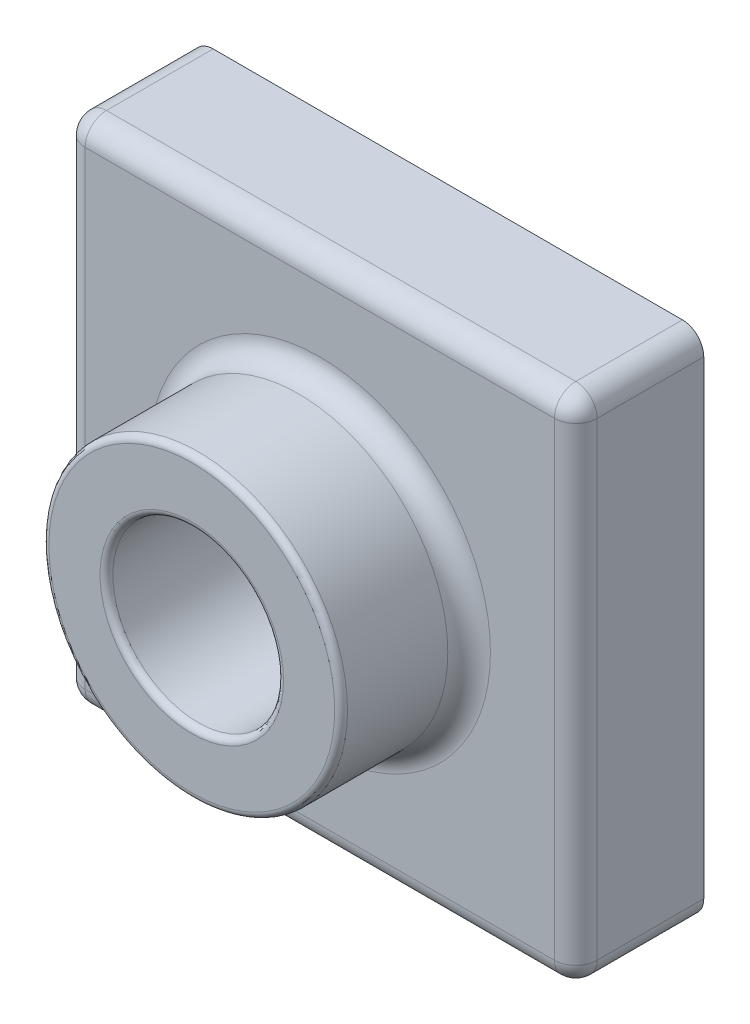
ISO-10303-21;
HEADER;
FILE_DESCRIPTION(('STEP AP214'),'2;1');
FILE_NAME('part.step','',(''),(''),'','','');
FILE_SCHEMA(('AUTOMOTIVE_DESIGN { 1 0 10303 214 1 1 1 1 }'));
ENDSEC;
DATA;
#1=APPLICATION_CONTEXT('core data for automotive mechanical design processes');
#2=APPLICATION_PROTOCOL_DEFINITION('international standard','automotive_design',2000,#1);
#3=PRODUCT_CONTEXT('',#1,'mechanical');
#4=PRODUCT('Part','Part','',(#3));
#5=PRODUCT_RELATED_PRODUCT_CATEGORY('part','',(#4));
#6=PRODUCT_DEFINITION_FORMATION('','',#4);
#7=PRODUCT_DEFINITION_CONTEXT('part definition',#1,'design');
#8=PRODUCT_DEFINITION('design','',#6,#7);
#9=PRODUCT_DEFINITION_SHAPE('','',#8);
#10=(LENGTH_UNIT() NAMED_UNIT(*) SI_UNIT(.MILLI.,.METRE.));
#11=(NAMED_UNIT(*) PLANE_ANGLE_UNIT() SI_UNIT($,.RADIAN.));
#12=(NAMED_UNIT(*) SI_UNIT($,.STERADIAN.) SOLID_ANGLE_UNIT());
#13=UNCERTAINTY_MEASURE_WITH_UNIT(LENGTH_MEASURE(1.E-05),#10,'distance_accuracy_value','');
#14=(GEOMETRIC_REPRESENTATION_CONTEXT(3) GLOBAL_UNCERTAINTY_ASSIGNED_CONTEXT((#13)) GLOBAL_UNIT_ASSIGNED_CONTEXT((#10,
#11,#12)) REPRESENTATION_CONTEXT('',''));
#15=CARTESIAN_POINT('',(0.,0.,0.));
#16=DIRECTION('',(0.,0.,1.));
#17=DIRECTION('',(1.,0.,0.));
#18=AXIS2_PLACEMENT_3D('',#15,#16,#17);
#19=CARTESIAN_POINT('',(0.,0.,0.));
#20=DIRECTION('',(0.,0.,1.));
#21=DIRECTION('',(1.,0.,0.));
#22=AXIS2_PLACEMENT_3D('',#19,#20,#21);
#23=PLANE('',#22);
#24=DIRECTION('',(0.,1.,0.));
#25=VECTOR('',#24,1.);
#26=CARTESIAN_POINT('',(60.,60.,0.));
#27=LINE('',#26,#25);
#28=CARTESIAN_POINT('',(60.,-55.,0.));
#29=VERTEX_POINT('',#28);
#30=CARTESIAN_POINT('',(60.,55.,0.));
#31=VERTEX_POINT('',#30);
#32=EDGE_CURVE('E256',#29,#31,#27,.T.);
#33=ORIENTED_EDGE('',*,*,#32,.F.);
#34=CARTESIAN_POINT('',(55.,-55.,0.));
#35=DIRECTION('',(0.,0.,1.));
#36=DIRECTION('',(1.,0.,0.));
#37=AXIS2_PLACEMENT_3D('',#34,#35,#36);
#38=CIRCLE('',#37,5.);
#39=CARTESIAN_POINT('',(55.,-60.,0.));
#40=VERTEX_POINT('',#39);
#41=EDGE_CURVE('E314',#29,#40,#38,.F.);
#42=ORIENTED_EDGE('',*,*,#41,.T.);
#43=DIRECTION('',(1.,0.,0.));
#44=VECTOR('',#43,1.);
#45=CARTESIAN_POINT('',(-60.,-60.,0.));
#46=LINE('',#45,#44);
#47=CARTESIAN_POINT('',(-55.,-60.,0.));
#48=VERTEX_POINT('',#47);
#49=EDGE_CURVE('E266',#48,#40,#46,.T.);
#50=ORIENTED_EDGE('',*,*,#49,.F.);
#51=CARTESIAN_POINT('',(-55.,-55.,0.));
#52=DIRECTION('',(0.,0.,1.));
#53=DIRECTION('',(1.,0.,0.));
#54=AXIS2_PLACEMENT_3D('',#51,#52,#53);
#55=CIRCLE('',#54,5.);
#56=CARTESIAN_POINT('',(-60.,-55.,0.));
#57=VERTEX_POINT('',#56);
#58=EDGE_CURVE('E312',#48,#57,#55,.F.);
#59=ORIENTED_EDGE('',*,*,#58,.T.);
#60=DIRECTION('',(0.,-1.,0.));
#61=VECTOR('',#60,1.);
#62=CARTESIAN_POINT('',(-60.,60.,0.));
#63=LINE('',#62,#61);
#64=CARTESIAN_POINT('',(-60.,55.,0.));
#65=VERTEX_POINT('',#64);
#66=EDGE_CURVE('E263',#65,#57,#63,.T.);
#67=ORIENTED_EDGE('',*,*,#66,.F.);
#68=CARTESIAN_POINT('',(-55.,55.,0.));
#69=DIRECTION('',(0.,0.,1.));
#70=DIRECTION('',(1.,0.,0.));
#71=AXIS2_PLACEMENT_3D('',#68,#69,#70);
#72=CIRCLE('',#71,5.);
#73=CARTESIAN_POINT('',(-55.,60.,0.));
#74=VERTEX_POINT('',#73);
#75=EDGE_CURVE('E310',#65,#74,#72,.F.);
#76=ORIENTED_EDGE('',*,*,#75,.T.);
#77=DIRECTION('',(-1.,0.,0.));
#78=VECTOR('',#77,1.);
#79=CARTESIAN_POINT('',(-60.,60.,0.));
#80=LINE('',#79,#78);
#81=CARTESIAN_POINT('',(55.,60.,0.));
#82=VERTEX_POINT('',#81);
#83=EDGE_CURVE('E259',#82,#74,#80,.T.);
#84=ORIENTED_EDGE('',*,*,#83,.F.);
#85=CARTESIAN_POINT('',(55.,55.,0.));
#86=DIRECTION('',(0.,0.,1.));
#87=DIRECTION('',(1.,0.,0.));
#88=AXIS2_PLACEMENT_3D('',#85,#86,#87);
#89=CIRCLE('',#88,5.);
#90=EDGE_CURVE('E308',#82,#31,#89,.F.);
#91=ORIENTED_EDGE('',*,*,#90,.T.);
#92=EDGE_LOOP('',(#33,#42,#50,#59,#67,#76,#84,#91));
#93=FACE_BOUND('',#92,.T.);
#94=CARTESIAN_POINT('',(55.,-55.,0.));
#95=DIRECTION('',(0.,0.,1.));
#96=DIRECTION('',(1.,0.,0.));
#97=AXIS2_PLACEMENT_3D('',#94,#95,#96);
#98=CIRCLE('',#97,3.);
#99=CARTESIAN_POINT('',(58.,-55.,0.));
#100=VERTEX_POINT('',#99);
#101=CARTESIAN_POINT('',(55.,-58.,0.));
#102=VERTEX_POINT('',#101);
#103=EDGE_CURVE('E236',#100,#102,#98,.F.);
#104=ORIENTED_EDGE('',*,*,#103,.F.);
#105=DIRECTION('',(0.,1.,0.));
#106=VECTOR('',#105,1.);
#107=CARTESIAN_POINT('',(58.,60.,0.));
#108=LINE('',#107,#106);
#109=CARTESIAN_POINT('',(58.,55.,0.));
#110=VERTEX_POINT('',#109);
#111=EDGE_CURVE('E189',#100,#110,#108,.T.);
#112=ORIENTED_EDGE('',*,*,#111,.T.);
#113=CARTESIAN_POINT('',(55.,55.,0.));
#114=DIRECTION('',(0.,0.,1.));
#115=DIRECTION('',(1.,0.,0.));
#116=AXIS2_PLACEMENT_3D('',#113,#114,#115);
#117=CIRCLE('',#116,3.);
#118=CARTESIAN_POINT('',(55.,58.,0.));
#119=VERTEX_POINT('',#118);
#120=EDGE_CURVE('E228',#119,#110,#117,.F.);
#121=ORIENTED_EDGE('',*,*,#120,.F.);
#122=DIRECTION('',(-1.,0.,0.));
#123=VECTOR('',#122,1.);
#124=CARTESIAN_POINT('',(-60.,58.,0.));
#125=LINE('',#124,#123);
#126=CARTESIAN_POINT('',(-55.,58.,0.));
#127=VERTEX_POINT('',#126);
#128=EDGE_CURVE('E48',#119,#127,#125,.T.);
#129=ORIENTED_EDGE('',*,*,#128,.T.);
#130=CARTESIAN_POINT('',(-55.,55.,0.));
#131=DIRECTION('',(0.,0.,1.));
#132=DIRECTION('',(1.,0.,0.));
#133=AXIS2_PLACEMENT_3D('',#130,#131,#132);
#134=CIRCLE('',#133,3.);
#135=CARTESIAN_POINT('',(-58.,55.,0.));
#136=VERTEX_POINT('',#135);
#137=EDGE_CURVE('E247',#136,#127,#134,.F.);
#138=ORIENTED_EDGE('',*,*,#137,.F.);
#139=DIRECTION('',(0.,-1.,0.));
#140=VECTOR('',#139,1.);
#141=CARTESIAN_POINT('',(-58.,60.,0.));
#142=LINE('',#141,#140);
#143=CARTESIAN_POINT('',(-58.,-55.,0.));
#144=VERTEX_POINT('',#143);
#145=EDGE_CURVE('E245',#136,#144,#142,.T.);
#146=ORIENTED_EDGE('',*,*,#145,.T.);
#147=CARTESIAN_POINT('',(-55.,-55.,0.));
#148=DIRECTION('',(0.,0.,1.));
#149=DIRECTION('',(1.,0.,0.));
#150=AXIS2_PLACEMENT_3D('',#147,#148,#149);
#151=CIRCLE('',#150,3.);
#152=CARTESIAN_POINT('',(-55.,-58.,0.));
#153=VERTEX_POINT('',#152);
#154=EDGE_CURVE('E240',#153,#144,#151,.F.);
#155=ORIENTED_EDGE('',*,*,#154,.F.);
#156=DIRECTION('',(1.,0.,0.));
#157=VECTOR('',#156,1.);
#158=CARTESIAN_POINT('',(-60.,-58.,0.));
#159=LINE('',#158,#157);
#160=EDGE_CURVE('E241',#153,#102,#159,.T.);
#161=ORIENTED_EDGE('',*,*,#160,.T.);
#162=EDGE_LOOP('',(#104,#112,#121,#129,#138,#146,#155,#161));
#163=FACE_BOUND('',#162,.T.);
#164=ADVANCED_FACE('F33',(#93,#163),#23,.F.);
#165=CARTESIAN_POINT('',(60.,60.,30.));
#166=DIRECTION('',(-1.,0.,0.));
#167=DIRECTION('',(0.,0.,1.));
#168=AXIS2_PLACEMENT_3D('',#165,#166,#167);
#169=PLANE('',#168);
#170=DIRECTION('',(0.,1.,0.));
#171=VECTOR('',#170,1.);
#172=CARTESIAN_POINT('',(60.,-60.,25.));
#173=LINE('',#172,#171);
#174=CARTESIAN_POINT('',(60.,55.,25.));
#175=VERTEX_POINT('',#174);
#176=CARTESIAN_POINT('',(60.,-55.,25.));
#177=VERTEX_POINT('',#176);
#178=EDGE_CURVE('E56',#175,#177,#173,.F.);
#179=ORIENTED_EDGE('',*,*,#178,.T.);
#180=DIRECTION('',(0.,0.,-1.));
#181=VECTOR('',#180,1.);
#182=CARTESIAN_POINT('',(60.,-55.,30.));
#183=LINE('',#182,#181);
#184=EDGE_CURVE('E303',#177,#29,#183,.T.);
#185=ORIENTED_EDGE('',*,*,#184,.T.);
#186=ORIENTED_EDGE('',*,*,#32,.T.);
#187=DIRECTION('',(0.,0.,-1.));
#188=VECTOR('',#187,1.);
#189=CARTESIAN_POINT('',(60.,55.,30.));
#190=LINE('',#189,#188);
#191=EDGE_CURVE('E300',#31,#175,#190,.F.);
#192=ORIENTED_EDGE('',*,*,#191,.T.);
#193=EDGE_LOOP('',(#179,#185,#186,#192));
#194=FACE_BOUND('',#193,.T.);
#195=ADVANCED_FACE('F378',(#194),#169,.F.);
#196=CARTESIAN_POINT('',(-60.,60.,30.));
#197=DIRECTION('',(0.,-1.,0.));
#198=DIRECTION('',(0.,0.,-1.));
#199=AXIS2_PLACEMENT_3D('',#196,#197,#198);
#200=PLANE('',#199);
#201=ORIENTED_EDGE('',*,*,#83,.T.);
#202=DIRECTION('',(0.,0.,-1.));
#203=VECTOR('',#202,1.);
#204=CARTESIAN_POINT('',(-55.,60.,30.));
#205=LINE('',#204,#203);
#206=CARTESIAN_POINT('',(-55.,60.,25.));
#207=VERTEX_POINT('',#206);
#208=EDGE_CURVE('E298',#74,#207,#205,.F.);
#209=ORIENTED_EDGE('',*,*,#208,.T.);
#210=DIRECTION('',(-1.,0.,0.));
#211=VECTOR('',#210,1.);
#212=CARTESIAN_POINT('',(60.,60.,25.));
#213=LINE('',#212,#211);
#214=CARTESIAN_POINT('',(55.,60.,25.));
#215=VERTEX_POINT('',#214);
#216=EDGE_CURVE('E296',#207,#215,#213,.F.);
#217=ORIENTED_EDGE('',*,*,#216,.T.);
#218=DIRECTION('',(0.,0.,-1.));
#219=VECTOR('',#218,1.);
#220=CARTESIAN_POINT('',(55.,60.,30.));
#221=LINE('',#220,#219);
#222=EDGE_CURVE('E294',#215,#82,#221,.T.);
#223=ORIENTED_EDGE('',*,*,#222,.T.);
#224=EDGE_LOOP('',(#201,#209,#217,#223));
#225=FACE_BOUND('',#224,.T.);
#226=ADVANCED_FACE('F384',(#225),#200,.F.);
#227=CARTESIAN_POINT('',(-60.,60.,30.));
#228=DIRECTION('',(1.,0.,0.));
#229=DIRECTION('',(0.,0.,-1.));
#230=AXIS2_PLACEMENT_3D('',#227,#228,#229);
#231=PLANE('',#230);
#232=ORIENTED_EDGE('',*,*,#66,.T.);
#233=DIRECTION('',(0.,0.,-1.));
#234=VECTOR('',#233,1.);
#235=CARTESIAN_POINT('',(-60.,-55.,30.));
#236=LINE('',#235,#234);
#237=CARTESIAN_POINT('',(-60.,-55.,25.));
#238=VERTEX_POINT('',#237);
#239=EDGE_CURVE('E292',#57,#238,#236,.F.);
#240=ORIENTED_EDGE('',*,*,#239,.T.);
#241=DIRECTION('',(0.,-1.,0.));
#242=VECTOR('',#241,1.);
#243=CARTESIAN_POINT('',(-60.,60.,25.));
#244=LINE('',#243,#242);
#245=CARTESIAN_POINT('',(-60.,55.,25.));
#246=VERTEX_POINT('',#245);
#247=EDGE_CURVE('E290',#238,#246,#244,.F.);
#248=ORIENTED_EDGE('',*,*,#247,.T.);
#249=DIRECTION('',(0.,0.,-1.));
#250=VECTOR('',#249,1.);
#251=CARTESIAN_POINT('',(-60.,55.,30.));
#252=LINE('',#251,#250);
#253=EDGE_CURVE('E288',#246,#65,#252,.T.);
#254=ORIENTED_EDGE('',*,*,#253,.T.);
#255=EDGE_LOOP('',(#232,#240,#248,#254));
#256=FACE_BOUND('',#255,.T.);
#257=ADVANCED_FACE('F867',(#256),#231,.F.);
#258=CARTESIAN_POINT('',(-60.,-60.,30.));
#259=DIRECTION('',(0.,1.,0.));
#260=DIRECTION('',(0.,0.,1.));
#261=AXIS2_PLACEMENT_3D('',#258,#259,#260);
#262=PLANE('',#261);
#263=ORIENTED_EDGE('',*,*,#49,.T.);
#264=DIRECTION('',(0.,0.,-1.));
#265=VECTOR('',#264,1.);
#266=CARTESIAN_POINT('',(55.,-60.,30.));
#267=LINE('',#266,#265);
#268=CARTESIAN_POINT('',(55.,-60.,25.));
#269=VERTEX_POINT('',#268);
#270=EDGE_CURVE('E286',#40,#269,#267,.F.);
#271=ORIENTED_EDGE('',*,*,#270,.T.);
#272=DIRECTION('',(1.,0.,0.));
#273=VECTOR('',#272,1.);
#274=CARTESIAN_POINT('',(-60.,-60.,25.));
#275=LINE('',#274,#273);
#276=CARTESIAN_POINT('',(-55.,-60.,25.));
#277=VERTEX_POINT('',#276);
#278=EDGE_CURVE('E283',#269,#277,#275,.F.);
#279=ORIENTED_EDGE('',*,*,#278,.T.);
#280=DIRECTION('',(0.,0.,-1.));
#281=VECTOR('',#280,1.);
#282=CARTESIAN_POINT('',(-55.,-60.,30.));
#283=LINE('',#282,#281);
#284=EDGE_CURVE('E281',#277,#48,#283,.T.);
#285=ORIENTED_EDGE('',*,*,#284,.T.);
#286=EDGE_LOOP('',(#263,#271,#279,#285));
#287=FACE_BOUND('',#286,.T.);
#288=ADVANCED_FACE('F401',(#287),#262,.F.);
#289=CARTESIAN_POINT('',(0.,0.,30.));
#290=DIRECTION('',(0.,0.,1.));
#291=DIRECTION('',(1.,0.,0.));
#292=AXIS2_PLACEMENT_3D('',#289,#290,#291);
#293=PLANE('',#292);
#294=DIRECTION('',(0.,-1.,0.));
#295=VECTOR('',#294,1.);
#296=CARTESIAN_POINT('',(-55.,-60.,30.));
#297=LINE('',#296,#295);
#298=CARTESIAN_POINT('',(-55.,55.,30.));
#299=VERTEX_POINT('',#298);
#300=CARTESIAN_POINT('',(-55.,-55.,30.));
#301=VERTEX_POINT('',#300);
#302=EDGE_CURVE('E276',#299,#301,#297,.T.);
#303=ORIENTED_EDGE('',*,*,#302,.T.);
#304=DIRECTION('',(1.,0.,0.));
#305=VECTOR('',#304,1.);
#306=CARTESIAN_POINT('',(60.,-55.,30.));
#307=LINE('',#306,#305);
#308=CARTESIAN_POINT('',(55.,-55.,30.));
#309=VERTEX_POINT('',#308);
#310=EDGE_CURVE('E278',#301,#309,#307,.T.);
#311=ORIENTED_EDGE('',*,*,#310,.T.);
#312=DIRECTION('',(0.,1.,0.));
#313=VECTOR('',#312,1.);
#314=CARTESIAN_POINT('',(55.,60.,30.));
#315=LINE('',#314,#313);
#316=CARTESIAN_POINT('',(55.,55.,30.));
#317=VERTEX_POINT('',#316);
#318=EDGE_CURVE('E272',#309,#317,#315,.T.);
#319=ORIENTED_EDGE('',*,*,#318,.T.);
#320=DIRECTION('',(-1.,0.,0.));
#321=VECTOR('',#320,1.);
#322=CARTESIAN_POINT('',(-60.,55.,30.));
#323=LINE('',#322,#321);
#324=EDGE_CURVE('E274',#317,#299,#323,.T.);
#325=ORIENTED_EDGE('',*,*,#324,.T.);
#326=EDGE_LOOP('',(#303,#311,#319,#325));
#327=FACE_BOUND('',#326,.T.);
#328=CARTESIAN_POINT('',(0.,0.,30.));
#329=DIRECTION('',(0.,0.,1.));
#330=DIRECTION('',(1.,0.,0.));
#331=AXIS2_PLACEMENT_3D('',#328,#329,#330);
#332=CIRCLE('',#331,40.);
#333=CARTESIAN_POINT('',(40.,0.,30.));
#334=VERTEX_POINT('',#333);
#335=EDGE_CURVE('E269',#334,#334,#332,.F.);
#336=ORIENTED_EDGE('',*,*,#335,.T.);
#337=EDGE_LOOP('',(#336));
#338=FACE_BOUND('',#337,.T.);
#339=ADVANCED_FACE('F392',(#327,#338),#293,.T.);
#340=CARTESIAN_POINT('',(0.,0.,0.));
#341=DIRECTION('',(0.,0.,1.));
#342=DIRECTION('',(1.,0.,0.));
#343=AXIS2_PLACEMENT_3D('',#340,#341,#342);
#344=CIRCLE('',#343,22.);
#345=CARTESIAN_POINT('',(22.,0.,0.));
#346=VERTEX_POINT('',#345);
#347=EDGE_CURVE('E232',#346,#346,#344,.T.);
#348=ORIENTED_EDGE('',*,*,#347,.F.);
#349=EDGE_LOOP('',(#348));
#350=FACE_BOUND('',#349,.T.);
#351=CARTESIAN_POINT('',(0.,0.,0.));
#352=DIRECTION('',(0.,0.,1.));
#353=DIRECTION('',(1.,0.,0.));
#354=AXIS2_PLACEMENT_3D('',#351,#352,#353);
#355=CIRCLE('',#354,21.5);
#356=CARTESIAN_POINT('',(21.5,0.,0.));
#357=VERTEX_POINT('',#356);
#358=EDGE_CURVE('E41',#357,#357,#355,.T.);
#359=ORIENTED_EDGE('',*,*,#358,.T.);
#360=EDGE_LOOP('',(#359));
#361=FACE_BOUND('',#360,.T.);
#362=ADVANCED_FACE('F362',(#350,#361),#23,.F.);
#363=CARTESIAN_POINT('',(0.,0.,60.));
#364=DIRECTION('',(0.,0.,-1.));
#365=DIRECTION('',(-1.,0.,0.));
#366=AXIS2_PLACEMENT_3D('',#363,#364,#365);
#367=CYLINDRICAL_SURFACE('',#366,35.);
#368=CARTESIAN_POINT('',(0.,0.,58.5));
#369=DIRECTION('',(0.,0.,1.));
#370=DIRECTION('',(1.,0.,0.));
#371=AXIS2_PLACEMENT_3D('',#368,#369,#370);
#372=CIRCLE('',#371,35.);
#373=CARTESIAN_POINT('',(35.,0.,58.5));
#374=VERTEX_POINT('',#373);
#375=EDGE_CURVE('E11',#374,#374,#372,.F.);
#376=ORIENTED_EDGE('',*,*,#375,.T.);
#377=EDGE_LOOP('',(#376));
#378=FACE_BOUND('',#377,.T.);
#379=CARTESIAN_POINT('',(0.,0.,35.));
#380=DIRECTION('',(0.,0.,1.));
#381=DIRECTION('',(1.,0.,0.));
#382=AXIS2_PLACEMENT_3D('',#379,#380,#381);
#383=CIRCLE('',#382,35.);
#384=CARTESIAN_POINT('',(35.,0.,35.));
#385=VERTEX_POINT('',#384);
#386=EDGE_CURVE('E305',#385,#385,#383,.T.);
#387=ORIENTED_EDGE('',*,*,#386,.T.);
#388=EDGE_LOOP('',(#387));
#389=FACE_BOUND('',#388,.T.);
#390=ADVANCED_FACE('F391',(#378,#389),#367,.T.);
#391=CARTESIAN_POINT('',(0.,0.,60.));
#392=DIRECTION('',(0.,0.,1.));
#393=DIRECTION('',(1.,0.,0.));
#394=AXIS2_PLACEMENT_3D('',#391,#392,#393);
#395=PLANE('',#394);
#396=CARTESIAN_POINT('',(0.,0.,60.));
#397=DIRECTION('',(0.,0.,1.));
#398=DIRECTION('',(1.,0.,0.));
#399=AXIS2_PLACEMENT_3D('',#396,#397,#398);
#400=CIRCLE('',#399,21.5);
#401=CARTESIAN_POINT('',(21.5,0.,60.));
#402=VERTEX_POINT('',#401);
#403=EDGE_CURVE('E357',#402,#402,#400,.F.);
#404=ORIENTED_EDGE('',*,*,#403,.T.);
#405=EDGE_LOOP('',(#404));
#406=FACE_BOUND('',#405,.T.);
#407=CARTESIAN_POINT('',(0.,0.,60.));
#408=DIRECTION('',(0.,0.,1.));
#409=DIRECTION('',(1.,0.,0.));
#410=AXIS2_PLACEMENT_3D('',#407,#408,#409);
#411=CIRCLE('',#410,33.5);
#412=CARTESIAN_POINT('',(33.5,0.,60.));
#413=VERTEX_POINT('',#412);
#414=EDGE_CURVE('E354',#413,#413,#411,.T.);
#415=ORIENTED_EDGE('',*,*,#414,.T.);
#416=EDGE_LOOP('',(#415));
#417=FACE_BOUND('',#416,.T.);
#418=ADVANCED_FACE('F398',(#406,#417),#395,.T.);
#419=CARTESIAN_POINT('',(0.,0.,0.));
#420=DIRECTION('',(0.,0.,1.));
#421=DIRECTION('',(1.,0.,0.));
#422=AXIS2_PLACEMENT_3D('',#419,#420,#421);
#423=CYLINDRICAL_SURFACE('',#422,20.);
#424=CARTESIAN_POINT('',(0.,0.,58.5));
#425=DIRECTION('',(0.,0.,1.));
#426=DIRECTION('',(1.,0.,0.));
#427=AXIS2_PLACEMENT_3D('',#424,#425,#426);
#428=CIRCLE('',#427,20.);
#429=CARTESIAN_POINT('',(20.,0.,58.5));
#430=VERTEX_POINT('',#429);
#431=EDGE_CURVE('E351',#430,#430,#428,.T.);
#432=ORIENTED_EDGE('',*,*,#431,.T.);
#433=EDGE_LOOP('',(#432));
#434=FACE_BOUND('',#433,.T.);
#435=CARTESIAN_POINT('',(0.,0.,1.5));
#436=DIRECTION('',(0.,0.,1.));
#437=DIRECTION('',(1.,0.,0.));
#438=AXIS2_PLACEMENT_3D('',#435,#436,#437);
#439=CIRCLE('',#438,20.);
#440=CARTESIAN_POINT('',(20.,0.,1.5));
#441=VERTEX_POINT('',#440);
#442=EDGE_CURVE('E316',#441,#441,#439,.F.);
#443=ORIENTED_EDGE('',*,*,#442,.T.);
#444=EDGE_LOOP('',(#443));
#445=FACE_BOUND('',#444,.T.);
#446=ADVANCED_FACE('F465',(#434,#445),#423,.F.);
#447=CARTESIAN_POINT('',(-55.,55.,30.));
#448=DIRECTION('',(0.,0.,-1.));
#449=DIRECTION('',(-1.,0.,0.));
#450=AXIS2_PLACEMENT_3D('',#447,#448,#449);
#451=CYLINDRICAL_SURFACE('',#450,5.);
#452=ORIENTED_EDGE('',*,*,#75,.F.);
#453=ORIENTED_EDGE('',*,*,#253,.F.);
#454=CARTESIAN_POINT('',(-55.,55.,25.));
#455=DIRECTION('',(0.,0.,1.));
#456=DIRECTION('',(1.,0.,0.));
#457=AXIS2_PLACEMENT_3D('',#454,#455,#456);
#458=CIRCLE('',#457,5.);
#459=EDGE_CURVE('E260',#207,#246,#458,.T.);
#460=ORIENTED_EDGE('',*,*,#459,.F.);
#461=ORIENTED_EDGE('',*,*,#208,.F.);
#462=EDGE_LOOP('',(#452,#453,#460,#461));
#463=FACE_BOUND('',#462,.T.);
#464=ADVANCED_FACE('F468',(#463),#451,.T.);
#465=CARTESIAN_POINT('',(0.,55.,25.));
#466=DIRECTION('',(1.,0.,0.));
#467=DIRECTION('',(0.,0.,-1.));
#468=AXIS2_PLACEMENT_3D('',#465,#466,#467);
#469=CYLINDRICAL_SURFACE('',#468,5.);
#470=CARTESIAN_POINT('',(55.,55.,25.));
#471=DIRECTION('',(1.,0.,0.));
#472=DIRECTION('',(0.,0.,-1.));
#473=AXIS2_PLACEMENT_3D('',#470,#471,#472);
#474=CIRCLE('',#473,5.);
#475=EDGE_CURVE('E341',#215,#317,#474,.T.);
#476=ORIENTED_EDGE('',*,*,#475,.F.);
#477=ORIENTED_EDGE('',*,*,#216,.F.);
#478=CARTESIAN_POINT('',(-55.,55.,25.));
#479=DIRECTION('',(-1.,0.,0.));
#480=DIRECTION('',(0.,0.,1.));
#481=AXIS2_PLACEMENT_3D('',#478,#479,#480);
#482=CIRCLE('',#481,5.);
#483=EDGE_CURVE('E344',#299,#207,#482,.T.);
#484=ORIENTED_EDGE('',*,*,#483,.F.);
#485=ORIENTED_EDGE('',*,*,#324,.F.);
#486=EDGE_LOOP('',(#476,#477,#484,#485));
#487=FACE_BOUND('',#486,.T.);
#488=ADVANCED_FACE('F494',(#487),#469,.T.);
#489=CARTESIAN_POINT('',(55.,55.,30.));
#490=DIRECTION('',(0.,0.,-1.));
#491=DIRECTION('',(-1.,0.,0.));
#492=AXIS2_PLACEMENT_3D('',#489,#490,#491);
#493=CYLINDRICAL_SURFACE('',#492,5.);
#494=ORIENTED_EDGE('',*,*,#90,.F.);
#495=ORIENTED_EDGE('',*,*,#222,.F.);
#496=CARTESIAN_POINT('',(55.,55.,25.));
#497=DIRECTION('',(0.,0.,1.));
#498=DIRECTION('',(1.,0.,0.));
#499=AXIS2_PLACEMENT_3D('',#496,#497,#498);
#500=CIRCLE('',#499,5.);
#501=EDGE_CURVE('E338',#175,#215,#500,.T.);
#502=ORIENTED_EDGE('',*,*,#501,.F.);
#503=ORIENTED_EDGE('',*,*,#191,.F.);
#504=EDGE_LOOP('',(#494,#495,#502,#503));
#505=FACE_BOUND('',#504,.T.);
#506=ADVANCED_FACE('F503',(#505),#493,.T.);
#507=CARTESIAN_POINT('',(-55.,55.,25.));
#508=DIRECTION('',(0.,1.,0.));
#509=DIRECTION('',(0.,0.,1.));
#510=AXIS2_PLACEMENT_3D('',#507,#508,#509);
#511=SPHERICAL_SURFACE('',#510,5.);
#512=ORIENTED_EDGE('',*,*,#483,.T.);
#513=ORIENTED_EDGE('',*,*,#459,.T.);
#514=CARTESIAN_POINT('',(-55.,55.,25.));
#515=DIRECTION('',(0.,1.,0.));
#516=DIRECTION('',(0.,0.,1.));
#517=AXIS2_PLACEMENT_3D('',#514,#515,#516);
#518=CIRCLE('',#517,5.);
#519=EDGE_CURVE('E335',#299,#246,#518,.F.);
#520=ORIENTED_EDGE('',*,*,#519,.F.);
#521=EDGE_LOOP('',(#512,#513,#520));
#522=FACE_BOUND('',#521,.T.);
#523=ADVANCED_FACE('F511',(#522),#511,.T.);
#524=CARTESIAN_POINT('',(55.,55.,25.));
#525=DIRECTION('',(0.,1.,0.));
#526=DIRECTION('',(-1.,0.,0.));
#527=AXIS2_PLACEMENT_3D('',#524,#525,#526);
#528=SPHERICAL_SURFACE('',#527,5.);
#529=ORIENTED_EDGE('',*,*,#501,.T.);
#530=ORIENTED_EDGE('',*,*,#475,.T.);
#531=CARTESIAN_POINT('',(55.,55.,25.));
#532=DIRECTION('',(0.,1.,0.));
#533=DIRECTION('',(0.,0.,1.));
#534=AXIS2_PLACEMENT_3D('',#531,#532,#533);
#535=CIRCLE('',#534,5.);
#536=EDGE_CURVE('E332',#175,#317,#535,.F.);
#537=ORIENTED_EDGE('',*,*,#536,.F.);
#538=EDGE_LOOP('',(#529,#530,#537));
#539=FACE_BOUND('',#538,.T.);
#540=ADVANCED_FACE('F519',(#539),#528,.T.);
#541=CARTESIAN_POINT('',(-55.,-55.,30.));
#542=DIRECTION('',(0.,0.,-1.));
#543=DIRECTION('',(-1.,0.,0.));
#544=AXIS2_PLACEMENT_3D('',#541,#542,#543);
#545=CYLINDRICAL_SURFACE('',#544,5.);
#546=ORIENTED_EDGE('',*,*,#58,.F.);
#547=ORIENTED_EDGE('',*,*,#284,.F.);
#548=CARTESIAN_POINT('',(-55.,-55.,25.));
#549=DIRECTION('',(0.,0.,1.));
#550=DIRECTION('',(1.,0.,0.));
#551=AXIS2_PLACEMENT_3D('',#548,#549,#550);
#552=CIRCLE('',#551,5.);
#553=EDGE_CURVE('E329',#238,#277,#552,.T.);
#554=ORIENTED_EDGE('',*,*,#553,.F.);
#555=ORIENTED_EDGE('',*,*,#239,.F.);
#556=EDGE_LOOP('',(#546,#547,#554,#555));
#557=FACE_BOUND('',#556,.T.);
#558=ADVANCED_FACE('F527',(#557),#545,.T.);
#559=CARTESIAN_POINT('',(-55.,0.,25.));
#560=DIRECTION('',(0.,1.,0.));
#561=DIRECTION('',(0.,0.,1.));
#562=AXIS2_PLACEMENT_3D('',#559,#560,#561);
#563=CYLINDRICAL_SURFACE('',#562,5.);
#564=ORIENTED_EDGE('',*,*,#519,.T.);
#565=ORIENTED_EDGE('',*,*,#247,.F.);
#566=CARTESIAN_POINT('',(-55.,-55.,25.));
#567=DIRECTION('',(0.,-1.,0.));
#568=DIRECTION('',(0.,0.,-1.));
#569=AXIS2_PLACEMENT_3D('',#566,#567,#568);
#570=CIRCLE('',#569,5.);
#571=EDGE_CURVE('E326',#301,#238,#570,.T.);
#572=ORIENTED_EDGE('',*,*,#571,.F.);
#573=ORIENTED_EDGE('',*,*,#302,.F.);
#574=EDGE_LOOP('',(#564,#565,#572,#573));
#575=FACE_BOUND('',#574,.T.);
#576=ADVANCED_FACE('F535',(#575),#563,.T.);
#577=CARTESIAN_POINT('',(55.,0.,25.));
#578=DIRECTION('',(0.,-1.,0.));
#579=DIRECTION('',(0.,0.,-1.));
#580=AXIS2_PLACEMENT_3D('',#577,#578,#579);
#581=CYLINDRICAL_SURFACE('',#580,5.);
#582=ORIENTED_EDGE('',*,*,#536,.T.);
#583=ORIENTED_EDGE('',*,*,#318,.F.);
#584=CARTESIAN_POINT('',(55.,-55.,25.));
#585=DIRECTION('',(0.,-1.,0.));
#586=DIRECTION('',(0.,0.,-1.));
#587=AXIS2_PLACEMENT_3D('',#584,#585,#586);
#588=CIRCLE('',#587,5.);
#589=EDGE_CURVE('E323',#177,#309,#588,.T.);
#590=ORIENTED_EDGE('',*,*,#589,.F.);
#591=ORIENTED_EDGE('',*,*,#178,.F.);
#592=EDGE_LOOP('',(#582,#583,#590,#591));
#593=FACE_BOUND('',#592,.T.);
#594=ADVANCED_FACE('F543',(#593),#581,.T.);
#595=CARTESIAN_POINT('',(55.,-55.,30.));
#596=DIRECTION('',(0.,0.,-1.));
#597=DIRECTION('',(-1.,0.,0.));
#598=AXIS2_PLACEMENT_3D('',#595,#596,#597);
#599=CYLINDRICAL_SURFACE('',#598,5.);
#600=ORIENTED_EDGE('',*,*,#41,.F.);
#601=ORIENTED_EDGE('',*,*,#184,.F.);
#602=CARTESIAN_POINT('',(55.,-55.,25.));
#603=DIRECTION('',(0.,0.,1.));
#604=DIRECTION('',(1.,0.,0.));
#605=AXIS2_PLACEMENT_3D('',#602,#603,#604);
#606=CIRCLE('',#605,5.);
#607=EDGE_CURVE('E320',#269,#177,#606,.T.);
#608=ORIENTED_EDGE('',*,*,#607,.F.);
#609=ORIENTED_EDGE('',*,*,#270,.F.);
#610=EDGE_LOOP('',(#600,#601,#608,#609));
#611=FACE_BOUND('',#610,.T.);
#612=ADVANCED_FACE('F551',(#611),#599,.T.);
#613=CARTESIAN_POINT('',(-55.,-55.,25.));
#614=DIRECTION('',(-1.,0.,0.));
#615=DIRECTION('',(0.,0.,1.));
#616=AXIS2_PLACEMENT_3D('',#613,#614,#615);
#617=SPHERICAL_SURFACE('',#616,5.);
#618=ORIENTED_EDGE('',*,*,#571,.T.);
#619=ORIENTED_EDGE('',*,*,#553,.T.);
#620=CARTESIAN_POINT('',(-55.,-55.,25.));
#621=DIRECTION('',(-1.,0.,0.));
#622=DIRECTION('',(0.,0.,1.));
#623=AXIS2_PLACEMENT_3D('',#620,#621,#622);
#624=CIRCLE('',#623,5.);
#625=EDGE_CURVE('E318',#301,#277,#624,.F.);
#626=ORIENTED_EDGE('',*,*,#625,.F.);
#627=EDGE_LOOP('',(#618,#619,#626));
#628=FACE_BOUND('',#627,.T.);
#629=ADVANCED_FACE('F559',(#628),#617,.T.);
#630=CARTESIAN_POINT('',(55.,-55.,25.));
#631=DIRECTION('',(1.,0.,0.));
#632=DIRECTION('',(0.,1.,0.));
#633=AXIS2_PLACEMENT_3D('',#630,#631,#632);
#634=SPHERICAL_SURFACE('',#633,5.);
#635=ORIENTED_EDGE('',*,*,#607,.T.);
#636=ORIENTED_EDGE('',*,*,#589,.T.);
#637=CARTESIAN_POINT('',(55.,-55.,25.));
#638=DIRECTION('',(1.,0.,0.));
#639=DIRECTION('',(0.,0.,-1.));
#640=AXIS2_PLACEMENT_3D('',#637,#638,#639);
#641=CIRCLE('',#640,5.);
#642=EDGE_CURVE('E255',#269,#309,#641,.F.);
#643=ORIENTED_EDGE('',*,*,#642,.F.);
#644=EDGE_LOOP('',(#635,#636,#643));
#645=FACE_BOUND('',#644,.T.);
#646=ADVANCED_FACE('F567',(#645),#634,.T.);
#647=CARTESIAN_POINT('',(0.,-55.,25.));
#648=DIRECTION('',(-1.,0.,0.));
#649=DIRECTION('',(0.,0.,1.));
#650=AXIS2_PLACEMENT_3D('',#647,#648,#649);
#651=CYLINDRICAL_SURFACE('',#650,5.);
#652=ORIENTED_EDGE('',*,*,#625,.T.);
#653=ORIENTED_EDGE('',*,*,#278,.F.);
#654=ORIENTED_EDGE('',*,*,#642,.T.);
#655=ORIENTED_EDGE('',*,*,#310,.F.);
#656=EDGE_LOOP('',(#652,#653,#654,#655));
#657=FACE_BOUND('',#656,.T.);
#658=ADVANCED_FACE('F575',(#657),#651,.T.);
#659=CARTESIAN_POINT('',(0.,0.,35.));
#660=DIRECTION('',(0.,0.,1.));
#661=DIRECTION('',(1.,0.,0.));
#662=AXIS2_PLACEMENT_3D('',#659,#660,#661);
#663=TOROIDAL_SURFACE('',#662,40.,5.);
#664=ORIENTED_EDGE('',*,*,#335,.F.);
#665=EDGE_LOOP('',(#664));
#666=FACE_BOUND('',#665,.T.);
#667=ORIENTED_EDGE('',*,*,#386,.F.);
#668=EDGE_LOOP('',(#667));
#669=FACE_BOUND('',#668,.T.);
#670=ADVANCED_FACE('F373',(#666,#669),#663,.F.);
#671=CARTESIAN_POINT('',(0.,0.,58.5));
#672=DIRECTION('',(0.,0.,1.));
#673=DIRECTION('',(1.,0.,0.));
#674=AXIS2_PLACEMENT_3D('',#671,#672,#673);
#675=TOROIDAL_SURFACE('',#674,21.5,1.5);
#676=ORIENTED_EDGE('',*,*,#403,.F.);
#677=EDGE_LOOP('',(#676));
#678=FACE_BOUND('',#677,.T.);
#679=ORIENTED_EDGE('',*,*,#431,.F.);
#680=EDGE_LOOP('',(#679));
#681=FACE_BOUND('',#680,.T.);
#682=ADVANCED_FACE('F366',(#678,#681),#675,.T.);
#683=CARTESIAN_POINT('',(0.,0.,1.5));
#684=DIRECTION('',(0.,0.,1.));
#685=DIRECTION('',(1.,0.,0.));
#686=AXIS2_PLACEMENT_3D('',#683,#684,#685);
#687=TOROIDAL_SURFACE('',#686,21.5,1.5);
#688=ORIENTED_EDGE('',*,*,#442,.F.);
#689=EDGE_LOOP('',(#688));
#690=FACE_BOUND('',#689,.T.);
#691=ORIENTED_EDGE('',*,*,#358,.F.);
#692=EDGE_LOOP('',(#691));
#693=FACE_BOUND('',#692,.T.);
#694=ADVANCED_FACE('F364',(#690,#693),#687,.T.);
#695=CARTESIAN_POINT('',(0.,0.,58.5));
#696=DIRECTION('',(0.,0.,1.));
#697=DIRECTION('',(1.,0.,0.));
#698=AXIS2_PLACEMENT_3D('',#695,#696,#697);
#699=TOROIDAL_SURFACE('',#698,33.5,1.5);
#700=ORIENTED_EDGE('',*,*,#375,.F.);
#701=EDGE_LOOP('',(#700));
#702=FACE_BOUND('',#701,.T.);
#703=ORIENTED_EDGE('',*,*,#414,.F.);
#704=EDGE_LOOP('',(#703));
#705=FACE_BOUND('',#704,.T.);
#706=ADVANCED_FACE('F35',(#702,#705),#699,.T.);
#707=CARTESIAN_POINT('',(58.,60.,30.));
#708=DIRECTION('',(-1.,0.,0.));
#709=DIRECTION('',(0.,0.,1.));
#710=AXIS2_PLACEMENT_3D('',#707,#708,#709);
#711=PLANE('',#710);
#712=DIRECTION('',(0.,1.,0.));
#713=VECTOR('',#712,1.);
#714=CARTESIAN_POINT('',(58.,60.,25.));
#715=LINE('',#714,#713);
#716=CARTESIAN_POINT('',(58.,55.,25.));
#717=VERTEX_POINT('',#716);
#718=CARTESIAN_POINT('',(58.,-55.,25.));
#719=VERTEX_POINT('',#718);
#720=EDGE_CURVE('E173',#717,#719,#715,.F.);
#721=ORIENTED_EDGE('',*,*,#720,.F.);
#722=DIRECTION('',(0.,0.,1.));
#723=VECTOR('',#722,1.);
#724=CARTESIAN_POINT('',(58.,55.,30.));
#725=LINE('',#724,#723);
#726=EDGE_CURVE('E184',#110,#717,#725,.T.);
#727=ORIENTED_EDGE('',*,*,#726,.F.);
#728=ORIENTED_EDGE('',*,*,#111,.F.);
#729=DIRECTION('',(0.,0.,1.));
#730=VECTOR('',#729,1.);
#731=CARTESIAN_POINT('',(58.,-55.,30.));
#732=LINE('',#731,#730);
#733=EDGE_CURVE('E183',#719,#100,#732,.F.);
#734=ORIENTED_EDGE('',*,*,#733,.F.);
#735=EDGE_LOOP('',(#721,#727,#728,#734));
#736=FACE_BOUND('',#735,.T.);
#737=ADVANCED_FACE('F187',(#736),#711,.T.);
#738=CARTESIAN_POINT('',(-60.,58.,30.));
#739=DIRECTION('',(0.,-1.,0.));
#740=DIRECTION('',(0.,0.,-1.));
#741=AXIS2_PLACEMENT_3D('',#738,#739,#740);
#742=PLANE('',#741);
#743=ORIENTED_EDGE('',*,*,#128,.F.);
#744=DIRECTION('',(0.,0.,-1.));
#745=VECTOR('',#744,1.);
#746=CARTESIAN_POINT('',(55.,58.,30.));
#747=LINE('',#746,#745);
#748=CARTESIAN_POINT('',(55.,58.,25.));
#749=VERTEX_POINT('',#748);
#750=EDGE_CURVE('E802',#749,#119,#747,.T.);
#751=ORIENTED_EDGE('',*,*,#750,.F.);
#752=DIRECTION('',(1.,0.,0.));
#753=VECTOR('',#752,1.);
#754=CARTESIAN_POINT('',(-60.,58.,25.));
#755=LINE('',#754,#753);
#756=CARTESIAN_POINT('',(-55.,58.,25.));
#757=VERTEX_POINT('',#756);
#758=EDGE_CURVE('E801',#757,#749,#755,.T.);
#759=ORIENTED_EDGE('',*,*,#758,.F.);
#760=DIRECTION('',(0.,0.,-1.));
#761=VECTOR('',#760,1.);
#762=CARTESIAN_POINT('',(-55.,58.,30.));
#763=LINE('',#762,#761);
#764=EDGE_CURVE('E804',#127,#757,#763,.F.);
#765=ORIENTED_EDGE('',*,*,#764,.F.);
#766=EDGE_LOOP('',(#743,#751,#759,#765));
#767=FACE_BOUND('',#766,.T.);
#768=ADVANCED_FACE('F623',(#767),#742,.T.);
#769=CARTESIAN_POINT('',(-58.,60.,30.));
#770=DIRECTION('',(1.,0.,0.));
#771=DIRECTION('',(0.,0.,-1.));
#772=AXIS2_PLACEMENT_3D('',#769,#770,#771);
#773=PLANE('',#772);
#774=ORIENTED_EDGE('',*,*,#145,.F.);
#775=DIRECTION('',(0.,0.,-1.));
#776=VECTOR('',#775,1.);
#777=CARTESIAN_POINT('',(-58.,55.,30.));
#778=LINE('',#777,#776);
#779=CARTESIAN_POINT('',(-58.,55.,25.));
#780=VERTEX_POINT('',#779);
#781=EDGE_CURVE('E213',#780,#136,#778,.T.);
#782=ORIENTED_EDGE('',*,*,#781,.F.);
#783=DIRECTION('',(0.,1.,0.));
#784=VECTOR('',#783,1.);
#785=CARTESIAN_POINT('',(-58.,60.,25.));
#786=LINE('',#785,#784);
#787=CARTESIAN_POINT('',(-58.,-55.,25.));
#788=VERTEX_POINT('',#787);
#789=EDGE_CURVE('E812',#788,#780,#786,.T.);
#790=ORIENTED_EDGE('',*,*,#789,.F.);
#791=DIRECTION('',(0.,0.,-1.));
#792=VECTOR('',#791,1.);
#793=CARTESIAN_POINT('',(-58.,-55.,30.));
#794=LINE('',#793,#792);
#795=EDGE_CURVE('E808',#144,#788,#794,.F.);
#796=ORIENTED_EDGE('',*,*,#795,.F.);
#797=EDGE_LOOP('',(#774,#782,#790,#796));
#798=FACE_BOUND('',#797,.T.);
#799=ADVANCED_FACE('F632',(#798),#773,.T.);
#800=CARTESIAN_POINT('',(-60.,-58.,30.));
#801=DIRECTION('',(0.,1.,0.));
#802=DIRECTION('',(0.,0.,1.));
#803=AXIS2_PLACEMENT_3D('',#800,#801,#802);
#804=PLANE('',#803);
#805=ORIENTED_EDGE('',*,*,#160,.F.);
#806=DIRECTION('',(0.,0.,1.));
#807=VECTOR('',#806,1.);
#808=CARTESIAN_POINT('',(-55.,-58.,30.));
#809=LINE('',#808,#807);
#810=CARTESIAN_POINT('',(-55.,-58.,25.));
#811=VERTEX_POINT('',#810);
#812=EDGE_CURVE('E217',#811,#153,#809,.F.);
#813=ORIENTED_EDGE('',*,*,#812,.F.);
#814=DIRECTION('',(1.,0.,0.));
#815=VECTOR('',#814,1.);
#816=CARTESIAN_POINT('',(-60.,-58.,25.));
#817=LINE('',#816,#815);
#818=CARTESIAN_POINT('',(55.,-58.,25.));
#819=VERTEX_POINT('',#818);
#820=EDGE_CURVE('E214',#819,#811,#817,.F.);
#821=ORIENTED_EDGE('',*,*,#820,.F.);
#822=DIRECTION('',(0.,0.,1.));
#823=VECTOR('',#822,1.);
#824=CARTESIAN_POINT('',(55.,-58.,30.));
#825=LINE('',#824,#823);
#826=EDGE_CURVE('E206',#102,#819,#825,.T.);
#827=ORIENTED_EDGE('',*,*,#826,.F.);
#828=EDGE_LOOP('',(#805,#813,#821,#827));
#829=FACE_BOUND('',#828,.T.);
#830=ADVANCED_FACE('F641',(#829),#804,.T.);
#831=CARTESIAN_POINT('',(0.,0.,28.));
#832=DIRECTION('',(0.,0.,1.));
#833=DIRECTION('',(1.,0.,0.));
#834=AXIS2_PLACEMENT_3D('',#831,#832,#833);
#835=PLANE('',#834);
#836=DIRECTION('',(0.,1.,0.));
#837=VECTOR('',#836,1.);
#838=CARTESIAN_POINT('',(-55.,0.,28.));
#839=LINE('',#838,#837);
#840=CARTESIAN_POINT('',(-55.,55.,28.));
#841=VERTEX_POINT('',#840);
#842=CARTESIAN_POINT('',(-55.,-55.,28.));
#843=VERTEX_POINT('',#842);
#844=EDGE_CURVE('E770',#841,#843,#839,.F.);
#845=ORIENTED_EDGE('',*,*,#844,.F.);
#846=DIRECTION('',(1.,0.,0.));
#847=VECTOR('',#846,1.);
#848=CARTESIAN_POINT('',(0.,55.,28.));
#849=LINE('',#848,#847);
#850=CARTESIAN_POINT('',(55.,55.,28.));
#851=VERTEX_POINT('',#850);
#852=EDGE_CURVE('E775',#851,#841,#849,.F.);
#853=ORIENTED_EDGE('',*,*,#852,.F.);
#854=DIRECTION('',(0.,1.,0.));
#855=VECTOR('',#854,1.);
#856=CARTESIAN_POINT('',(55.,0.,28.));
#857=LINE('',#856,#855);
#858=CARTESIAN_POINT('',(55.,-55.,28.));
#859=VERTEX_POINT('',#858);
#860=EDGE_CURVE('E773',#859,#851,#857,.T.);
#861=ORIENTED_EDGE('',*,*,#860,.F.);
#862=DIRECTION('',(1.,0.,0.));
#863=VECTOR('',#862,1.);
#864=CARTESIAN_POINT('',(0.,-55.,28.));
#865=LINE('',#864,#863);
#866=EDGE_CURVE('E219',#843,#859,#865,.T.);
#867=ORIENTED_EDGE('',*,*,#866,.F.);
#868=EDGE_LOOP('',(#845,#853,#861,#867));
#869=FACE_BOUND('',#868,.T.);
#870=CARTESIAN_POINT('',(0.,0.,28.));
#871=DIRECTION('',(0.,0.,1.));
#872=DIRECTION('',(1.,0.,0.));
#873=AXIS2_PLACEMENT_3D('',#870,#871,#872);
#874=CIRCLE('',#873,40.);
#875=CARTESIAN_POINT('',(40.,0.,28.));
#876=VERTEX_POINT('',#875);
#877=EDGE_CURVE('E244',#876,#876,#874,.F.);
#878=ORIENTED_EDGE('',*,*,#877,.F.);
#879=EDGE_LOOP('',(#878));
#880=FACE_BOUND('',#879,.T.);
#881=ADVANCED_FACE('F651',(#869,#880),#835,.F.);
#882=CARTESIAN_POINT('',(0.,0.,60.));
#883=DIRECTION('',(0.,0.,-1.));
#884=DIRECTION('',(-1.,0.,0.));
#885=AXIS2_PLACEMENT_3D('',#882,#883,#884);
#886=CYLINDRICAL_SURFACE('',#885,33.);
#887=CARTESIAN_POINT('',(0.,0.,58.));
#888=DIRECTION('',(0.,0.,1.));
#889=DIRECTION('',(1.,0.,0.));
#890=AXIS2_PLACEMENT_3D('',#887,#888,#889);
#891=CIRCLE('',#890,33.);
#892=CARTESIAN_POINT('',(33.,0.,58.));
#893=VERTEX_POINT('',#892);
#894=EDGE_CURVE('E229',#893,#893,#891,.T.);
#895=ORIENTED_EDGE('',*,*,#894,.T.);
#896=EDGE_LOOP('',(#895));
#897=FACE_BOUND('',#896,.T.);
#898=CARTESIAN_POINT('',(0.,0.,35.));
#899=DIRECTION('',(0.,0.,-1.));
#900=DIRECTION('',(-1.,0.,0.));
#901=AXIS2_PLACEMENT_3D('',#898,#899,#900);
#902=CIRCLE('',#901,33.);
#903=CARTESIAN_POINT('',(-33.,0.,35.));
#904=VERTEX_POINT('',#903);
#905=EDGE_CURVE('E193',#904,#904,#902,.F.);
#906=ORIENTED_EDGE('',*,*,#905,.F.);
#907=EDGE_LOOP('',(#906));
#908=FACE_BOUND('',#907,.T.);
#909=ADVANCED_FACE('F418',(#897,#908),#886,.F.);
#910=CARTESIAN_POINT('',(0.,0.,58.));
#911=DIRECTION('',(0.,0.,1.));
#912=DIRECTION('',(1.,0.,0.));
#913=AXIS2_PLACEMENT_3D('',#910,#911,#912);
#914=PLANE('',#913);
#915=CARTESIAN_POINT('',(0.,0.,58.));
#916=DIRECTION('',(0.,0.,1.));
#917=DIRECTION('',(1.,0.,0.));
#918=AXIS2_PLACEMENT_3D('',#915,#916,#917);
#919=CIRCLE('',#918,22.);
#920=CARTESIAN_POINT('',(22.,0.,58.));
#921=VERTEX_POINT('',#920);
#922=EDGE_CURVE('E233',#921,#921,#919,.T.);
#923=ORIENTED_EDGE('',*,*,#922,.T.);
#924=EDGE_LOOP('',(#923));
#925=FACE_BOUND('',#924,.T.);
#926=ORIENTED_EDGE('',*,*,#894,.F.);
#927=EDGE_LOOP('',(#926));
#928=FACE_BOUND('',#927,.T.);
#929=ADVANCED_FACE('F408',(#925,#928),#914,.F.);
#930=CARTESIAN_POINT('',(0.,0.,0.));
#931=DIRECTION('',(0.,0.,1.));
#932=DIRECTION('',(1.,0.,0.));
#933=AXIS2_PLACEMENT_3D('',#930,#931,#932);
#934=CYLINDRICAL_SURFACE('',#933,22.);
#935=ORIENTED_EDGE('',*,*,#922,.F.);
#936=EDGE_LOOP('',(#935));
#937=FACE_BOUND('',#936,.T.);
#938=ORIENTED_EDGE('',*,*,#347,.T.);
#939=EDGE_LOOP('',(#938));
#940=FACE_BOUND('',#939,.T.);
#941=ADVANCED_FACE('F405',(#937,#940),#934,.T.);
#942=CARTESIAN_POINT('',(-55.,55.,30.));
#943=DIRECTION('',(0.,0.,-1.));
#944=DIRECTION('',(-1.,0.,0.));
#945=AXIS2_PLACEMENT_3D('',#942,#943,#944);
#946=CYLINDRICAL_SURFACE('',#945,3.);
#947=ORIENTED_EDGE('',*,*,#137,.T.);
#948=ORIENTED_EDGE('',*,*,#764,.T.);
#949=CARTESIAN_POINT('',(-55.,55.,25.));
#950=DIRECTION('',(0.,0.,-1.));
#951=DIRECTION('',(-1.,0.,0.));
#952=AXIS2_PLACEMENT_3D('',#949,#950,#951);
#953=CIRCLE('',#952,3.);
#954=EDGE_CURVE('E238',#757,#780,#953,.F.);
#955=ORIENTED_EDGE('',*,*,#954,.T.);
#956=ORIENTED_EDGE('',*,*,#781,.T.);
#957=EDGE_LOOP('',(#947,#948,#955,#956));
#958=FACE_BOUND('',#957,.T.);
#959=ADVANCED_FACE('F407',(#958),#946,.F.);
#960=CARTESIAN_POINT('',(0.,55.,25.));
#961=DIRECTION('',(1.,0.,0.));
#962=DIRECTION('',(0.,0.,-1.));
#963=AXIS2_PLACEMENT_3D('',#960,#961,#962);
#964=CYLINDRICAL_SURFACE('',#963,3.);
#965=CARTESIAN_POINT('',(55.,55.,25.));
#966=DIRECTION('',(-1.,0.,0.));
#967=DIRECTION('',(0.,0.,1.));
#968=AXIS2_PLACEMENT_3D('',#965,#966,#967);
#969=CIRCLE('',#968,3.);
#970=EDGE_CURVE('E779',#749,#851,#969,.F.);
#971=ORIENTED_EDGE('',*,*,#970,.T.);
#972=ORIENTED_EDGE('',*,*,#852,.T.);
#973=CARTESIAN_POINT('',(-55.,55.,25.));
#974=DIRECTION('',(-1.,0.,0.));
#975=DIRECTION('',(0.,0.,1.));
#976=AXIS2_PLACEMENT_3D('',#973,#974,#975);
#977=CIRCLE('',#976,3.);
#978=EDGE_CURVE('E781',#841,#757,#977,.T.);
#979=ORIENTED_EDGE('',*,*,#978,.T.);
#980=ORIENTED_EDGE('',*,*,#758,.T.);
#981=EDGE_LOOP('',(#971,#972,#979,#980));
#982=FACE_BOUND('',#981,.T.);
#983=ADVANCED_FACE('F415',(#982),#964,.F.);
#984=CARTESIAN_POINT('',(55.,55.,30.));
#985=DIRECTION('',(0.,0.,-1.));
#986=DIRECTION('',(-1.,0.,0.));
#987=AXIS2_PLACEMENT_3D('',#984,#985,#986);
#988=CYLINDRICAL_SURFACE('',#987,3.);
#989=ORIENTED_EDGE('',*,*,#120,.T.);
#990=ORIENTED_EDGE('',*,*,#726,.T.);
#991=CARTESIAN_POINT('',(55.,55.,25.));
#992=DIRECTION('',(0.,0.,1.));
#993=DIRECTION('',(1.,0.,0.));
#994=AXIS2_PLACEMENT_3D('',#991,#992,#993);
#995=CIRCLE('',#994,3.);
#996=EDGE_CURVE('E782',#717,#749,#995,.T.);
#997=ORIENTED_EDGE('',*,*,#996,.T.);
#998=ORIENTED_EDGE('',*,*,#750,.T.);
#999=EDGE_LOOP('',(#989,#990,#997,#998));
#1000=FACE_BOUND('',#999,.T.);
#1001=ADVANCED_FACE('F426',(#1000),#988,.F.);
#1002=CARTESIAN_POINT('',(-55.,55.,25.));
#1003=DIRECTION('',(0.,1.,0.));
#1004=DIRECTION('',(0.,0.,1.));
#1005=AXIS2_PLACEMENT_3D('',#1002,#1003,#1004);
#1006=SPHERICAL_SURFACE('',#1005,3.);
#1007=ORIENTED_EDGE('',*,*,#978,.F.);
#1008=CARTESIAN_POINT('',(-55.,55.,25.));
#1009=DIRECTION('',(0.,1.,0.));
#1010=DIRECTION('',(0.,0.,1.));
#1011=AXIS2_PLACEMENT_3D('',#1008,#1009,#1010);
#1012=CIRCLE('',#1011,3.);
#1013=EDGE_CURVE('E783',#841,#780,#1012,.F.);
#1014=ORIENTED_EDGE('',*,*,#1013,.T.);
#1015=ORIENTED_EDGE('',*,*,#954,.F.);
#1016=EDGE_LOOP('',(#1007,#1014,#1015));
#1017=FACE_BOUND('',#1016,.T.);
#1018=ADVANCED_FACE('F430',(#1017),#1006,.F.);
#1019=CARTESIAN_POINT('',(55.,55.,25.));
#1020=DIRECTION('',(0.,1.,0.));
#1021=DIRECTION('',(-1.,0.,0.));
#1022=AXIS2_PLACEMENT_3D('',#1019,#1020,#1021);
#1023=SPHERICAL_SURFACE('',#1022,3.);
#1024=ORIENTED_EDGE('',*,*,#996,.F.);
#1025=CARTESIAN_POINT('',(55.,55.,25.));
#1026=DIRECTION('',(0.,-1.,0.));
#1027=DIRECTION('',(0.,0.,-1.));
#1028=AXIS2_PLACEMENT_3D('',#1025,#1026,#1027);
#1029=CIRCLE('',#1028,3.);
#1030=EDGE_CURVE('E180',#717,#851,#1029,.T.);
#1031=ORIENTED_EDGE('',*,*,#1030,.T.);
#1032=ORIENTED_EDGE('',*,*,#970,.F.);
#1033=EDGE_LOOP('',(#1024,#1031,#1032));
#1034=FACE_BOUND('',#1033,.T.);
#1035=ADVANCED_FACE('F434',(#1034),#1023,.F.);
#1036=CARTESIAN_POINT('',(-55.,-55.,30.));
#1037=DIRECTION('',(0.,0.,-1.));
#1038=DIRECTION('',(-1.,0.,0.));
#1039=AXIS2_PLACEMENT_3D('',#1036,#1037,#1038);
#1040=CYLINDRICAL_SURFACE('',#1039,3.);
#1041=ORIENTED_EDGE('',*,*,#154,.T.);
#1042=ORIENTED_EDGE('',*,*,#795,.T.);
#1043=CARTESIAN_POINT('',(-55.,-55.,25.));
#1044=DIRECTION('',(0.,0.,-1.));
#1045=DIRECTION('',(0.,1.,0.));
#1046=AXIS2_PLACEMENT_3D('',#1043,#1044,#1045);
#1047=CIRCLE('',#1046,3.);
#1048=EDGE_CURVE('E220',#788,#811,#1047,.F.);
#1049=ORIENTED_EDGE('',*,*,#1048,.T.);
#1050=ORIENTED_EDGE('',*,*,#812,.T.);
#1051=EDGE_LOOP('',(#1041,#1042,#1049,#1050));
#1052=FACE_BOUND('',#1051,.T.);
#1053=ADVANCED_FACE('F438',(#1052),#1040,.F.);
#1054=CARTESIAN_POINT('',(-55.,0.,25.));
#1055=DIRECTION('',(0.,1.,0.));
#1056=DIRECTION('',(0.,0.,1.));
#1057=AXIS2_PLACEMENT_3D('',#1054,#1055,#1056);
#1058=CYLINDRICAL_SURFACE('',#1057,3.);
#1059=ORIENTED_EDGE('',*,*,#1013,.F.);
#1060=ORIENTED_EDGE('',*,*,#844,.T.);
#1061=CARTESIAN_POINT('',(-55.,-55.,25.));
#1062=DIRECTION('',(0.,-1.,0.));
#1063=DIRECTION('',(0.,0.,-1.));
#1064=AXIS2_PLACEMENT_3D('',#1061,#1062,#1063);
#1065=CIRCLE('',#1064,3.);
#1066=EDGE_CURVE('E202',#843,#788,#1065,.T.);
#1067=ORIENTED_EDGE('',*,*,#1066,.T.);
#1068=ORIENTED_EDGE('',*,*,#789,.T.);
#1069=EDGE_LOOP('',(#1059,#1060,#1067,#1068));
#1070=FACE_BOUND('',#1069,.T.);
#1071=ADVANCED_FACE('F442',(#1070),#1058,.F.);
#1072=CARTESIAN_POINT('',(55.,0.,25.));
#1073=DIRECTION('',(0.,-1.,0.));
#1074=DIRECTION('',(0.,0.,-1.));
#1075=AXIS2_PLACEMENT_3D('',#1072,#1073,#1074);
#1076=CYLINDRICAL_SURFACE('',#1075,3.);
#1077=ORIENTED_EDGE('',*,*,#1030,.F.);
#1078=ORIENTED_EDGE('',*,*,#720,.T.);
#1079=CARTESIAN_POINT('',(55.,-55.,25.));
#1080=DIRECTION('',(0.,1.,0.));
#1081=DIRECTION('',(0.,0.,1.));
#1082=AXIS2_PLACEMENT_3D('',#1079,#1080,#1081);
#1083=CIRCLE('',#1082,3.);
#1084=EDGE_CURVE('E177',#719,#859,#1083,.F.);
#1085=ORIENTED_EDGE('',*,*,#1084,.T.);
#1086=ORIENTED_EDGE('',*,*,#860,.T.);
#1087=EDGE_LOOP('',(#1077,#1078,#1085,#1086));
#1088=FACE_BOUND('',#1087,.T.);
#1089=ADVANCED_FACE('F175',(#1088),#1076,.F.);
#1090=CARTESIAN_POINT('',(55.,-55.,30.));
#1091=DIRECTION('',(0.,0.,-1.));
#1092=DIRECTION('',(-1.,0.,0.));
#1093=AXIS2_PLACEMENT_3D('',#1090,#1091,#1092);
#1094=CYLINDRICAL_SURFACE('',#1093,3.);
#1095=ORIENTED_EDGE('',*,*,#103,.T.);
#1096=ORIENTED_EDGE('',*,*,#826,.T.);
#1097=CARTESIAN_POINT('',(55.,-55.,25.));
#1098=DIRECTION('',(0.,0.,1.));
#1099=DIRECTION('',(0.,-1.,0.));
#1100=AXIS2_PLACEMENT_3D('',#1097,#1098,#1099);
#1101=CIRCLE('',#1100,3.);
#1102=EDGE_CURVE('E198',#819,#719,#1101,.T.);
#1103=ORIENTED_EDGE('',*,*,#1102,.T.);
#1104=ORIENTED_EDGE('',*,*,#733,.T.);
#1105=EDGE_LOOP('',(#1095,#1096,#1103,#1104));
#1106=FACE_BOUND('',#1105,.T.);
#1107=ADVANCED_FACE('F204',(#1106),#1094,.F.);
#1108=CARTESIAN_POINT('',(-55.,-55.,25.));
#1109=DIRECTION('',(-1.,0.,0.));
#1110=DIRECTION('',(0.,0.,1.));
#1111=AXIS2_PLACEMENT_3D('',#1108,#1109,#1110);
#1112=SPHERICAL_SURFACE('',#1111,3.);
#1113=ORIENTED_EDGE('',*,*,#1066,.F.);
#1114=CARTESIAN_POINT('',(-55.,-55.,25.));
#1115=DIRECTION('',(-1.,0.,0.));
#1116=DIRECTION('',(0.,0.,1.));
#1117=AXIS2_PLACEMENT_3D('',#1114,#1115,#1116);
#1118=CIRCLE('',#1117,3.);
#1119=EDGE_CURVE('E207',#843,#811,#1118,.F.);
#1120=ORIENTED_EDGE('',*,*,#1119,.T.);
#1121=ORIENTED_EDGE('',*,*,#1048,.F.);
#1122=EDGE_LOOP('',(#1113,#1120,#1121));
#1123=FACE_BOUND('',#1122,.T.);
#1124=ADVANCED_FACE('F451',(#1123),#1112,.F.);
#1125=CARTESIAN_POINT('',(55.,-55.,25.));
#1126=DIRECTION('',(1.,0.,0.));
#1127=DIRECTION('',(0.,1.,0.));
#1128=AXIS2_PLACEMENT_3D('',#1125,#1126,#1127);
#1129=SPHERICAL_SURFACE('',#1128,3.);
#1130=ORIENTED_EDGE('',*,*,#1102,.F.);
#1131=CARTESIAN_POINT('',(55.,-55.,25.));
#1132=DIRECTION('',(-1.,0.,0.));
#1133=DIRECTION('',(0.,0.,1.));
#1134=AXIS2_PLACEMENT_3D('',#1131,#1132,#1133);
#1135=CIRCLE('',#1134,3.);
#1136=EDGE_CURVE('E201',#819,#859,#1135,.T.);
#1137=ORIENTED_EDGE('',*,*,#1136,.T.);
#1138=ORIENTED_EDGE('',*,*,#1084,.F.);
#1139=EDGE_LOOP('',(#1130,#1137,#1138));
#1140=FACE_BOUND('',#1139,.T.);
#1141=ADVANCED_FACE('F197',(#1140),#1129,.F.);
#1142=CARTESIAN_POINT('',(0.,-55.,25.));
#1143=DIRECTION('',(-1.,0.,0.));
#1144=DIRECTION('',(0.,0.,1.));
#1145=AXIS2_PLACEMENT_3D('',#1142,#1143,#1144);
#1146=CYLINDRICAL_SURFACE('',#1145,3.);
#1147=ORIENTED_EDGE('',*,*,#1119,.F.);
#1148=ORIENTED_EDGE('',*,*,#866,.T.);
#1149=ORIENTED_EDGE('',*,*,#1136,.F.);
#1150=ORIENTED_EDGE('',*,*,#820,.T.);
#1151=EDGE_LOOP('',(#1147,#1148,#1149,#1150));
#1152=FACE_BOUND('',#1151,.T.);
#1153=ADVANCED_FACE('F457',(#1152),#1146,.F.);
#1154=CARTESIAN_POINT('',(0.,0.,35.));
#1155=DIRECTION('',(0.,0.,1.));
#1156=DIRECTION('',(1.,0.,0.));
#1157=AXIS2_PLACEMENT_3D('',#1154,#1155,#1156);
#1158=TOROIDAL_SURFACE('',#1157,40.,7.);
#1159=ORIENTED_EDGE('',*,*,#877,.T.);
#1160=EDGE_LOOP('',(#1159));
#1161=FACE_BOUND('',#1160,.T.);
#1162=ORIENTED_EDGE('',*,*,#905,.T.);
#1163=EDGE_LOOP('',(#1162));
#1164=FACE_BOUND('',#1163,.T.);
#1165=ADVANCED_FACE('F460',(#1161,#1164),#1158,.T.);
#1166=CLOSED_SHELL('',(#164,#195,#226,#257,#288,#339,#362,#390,#418,#446,#464,#488,#506,#523,
#540,#558,#576,#594,#612,#629,#646,#658,#670,#682,#694,#706,#737,#768,#799,#830,#881,#909,#929,
#941,#959,#983,#1001,#1018,#1035,#1053,#1071,#1089,#1107,#1124,#1141,#1153,#1165));
#1167=MANIFOLD_SOLID_BREP('B2',#1166);
#1168=ADVANCED_BREP_SHAPE_REPRESENTATION('',(#18,#1167),#14);
#1169=SHAPE_DEFINITION_REPRESENTATION(#9,#1168);
ENDSEC;
END-ISO-10303-21;
